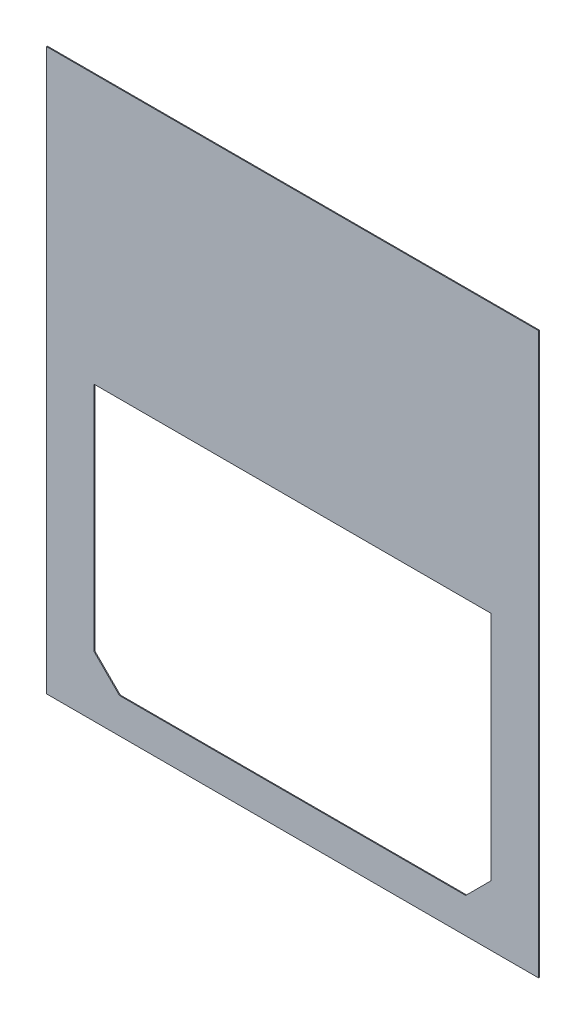
ISO-10303-21;
HEADER;
FILE_DESCRIPTION(('STEP AP214'),'2;1');
FILE_NAME('part.step','',(''),(''),'','','');
FILE_SCHEMA(('AUTOMOTIVE_DESIGN { 1 0 10303 214 1 1 1 1 }'));
ENDSEC;
DATA;
#1=APPLICATION_CONTEXT('core data for automotive mechanical design processes');
#2=APPLICATION_PROTOCOL_DEFINITION('international standard','automotive_design',2000,#1);
#3=PRODUCT_CONTEXT('',#1,'mechanical');
#4=PRODUCT('Part','Part','',(#3));
#5=PRODUCT_RELATED_PRODUCT_CATEGORY('part','',(#4));
#6=PRODUCT_DEFINITION_FORMATION('','',#4);
#7=PRODUCT_DEFINITION_CONTEXT('part definition',#1,'design');
#8=PRODUCT_DEFINITION('design','',#6,#7);
#9=PRODUCT_DEFINITION_SHAPE('','',#8);
#10=(LENGTH_UNIT() NAMED_UNIT(*) SI_UNIT(.MILLI.,.METRE.));
#11=(NAMED_UNIT(*) PLANE_ANGLE_UNIT() SI_UNIT($,.RADIAN.));
#12=(NAMED_UNIT(*) SI_UNIT($,.STERADIAN.) SOLID_ANGLE_UNIT());
#13=UNCERTAINTY_MEASURE_WITH_UNIT(LENGTH_MEASURE(1.E-05),#10,'distance_accuracy_value','');
#14=(GEOMETRIC_REPRESENTATION_CONTEXT(3) GLOBAL_UNCERTAINTY_ASSIGNED_CONTEXT((#13)) GLOBAL_UNIT_ASSIGNED_CONTEXT((#10,
#11,#12)) REPRESENTATION_CONTEXT('',''));
#15=CARTESIAN_POINT('',(0.,0.,0.));
#16=DIRECTION('',(0.,0.,1.));
#17=DIRECTION('',(1.,0.,0.));
#18=AXIS2_PLACEMENT_3D('',#15,#16,#17);
#19=CARTESIAN_POINT('',(-421.5,0.,-1.5));
#20=DIRECTION('',(-1.,0.,0.));
#21=DIRECTION('',(0.,0.,1.));
#22=AXIS2_PLACEMENT_3D('',#19,#20,#21);
#23=PLANE('',#22);
#24=DIRECTION('',(0.,-1.,0.));
#25=VECTOR('',#24,1.);
#26=CARTESIAN_POINT('',(-421.5,0.,0.));
#27=LINE('',#26,#25);
#28=CARTESIAN_POINT('',(-421.5,960.,0.));
#29=VERTEX_POINT('',#28);
#30=CARTESIAN_POINT('',(-421.5,0.,0.));
#31=VERTEX_POINT('',#30);
#32=EDGE_CURVE('E162',#29,#31,#27,.T.);
#33=ORIENTED_EDGE('',*,*,#32,.F.);
#34=DIRECTION('',(0.,0.,1.));
#35=VECTOR('',#34,1.);
#36=CARTESIAN_POINT('',(-421.5,960.,-1.5));
#37=LINE('',#36,#35);
#38=CARTESIAN_POINT('',(-421.5,960.,-1.5));
#39=VERTEX_POINT('',#38);
#40=EDGE_CURVE('E11',#39,#29,#37,.T.);
#41=ORIENTED_EDGE('',*,*,#40,.F.);
#42=DIRECTION('',(0.,-1.,0.));
#43=VECTOR('',#42,1.);
#44=CARTESIAN_POINT('',(-421.5,0.,-1.5));
#45=LINE('',#44,#43);
#46=CARTESIAN_POINT('',(-421.5,0.,-1.5));
#47=VERTEX_POINT('',#46);
#48=EDGE_CURVE('E170',#39,#47,#45,.T.);
#49=ORIENTED_EDGE('',*,*,#48,.T.);
#50=DIRECTION('',(0.,0.,1.));
#51=VECTOR('',#50,1.);
#52=CARTESIAN_POINT('',(-421.5,0.,-1.5));
#53=LINE('',#52,#51);
#54=EDGE_CURVE('E43',#47,#31,#53,.T.);
#55=ORIENTED_EDGE('',*,*,#54,.T.);
#56=EDGE_LOOP('',(#33,#41,#49,#55));
#57=FACE_BOUND('',#56,.T.);
#58=ADVANCED_FACE('F40',(#57),#23,.T.);
#59=CARTESIAN_POINT('',(-421.5,960.,-1.5));
#60=DIRECTION('',(0.,1.,0.));
#61=DIRECTION('',(-1.,0.,0.));
#62=AXIS2_PLACEMENT_3D('',#59,#60,#61);
#63=PLANE('',#62);
#64=DIRECTION('',(-1.,0.,0.));
#65=VECTOR('',#64,1.);
#66=CARTESIAN_POINT('',(-421.5,960.,0.));
#67=LINE('',#66,#65);
#68=CARTESIAN_POINT('',(421.5,960.,0.));
#69=VERTEX_POINT('',#68);
#70=EDGE_CURVE('E174',#69,#29,#67,.T.);
#71=ORIENTED_EDGE('',*,*,#70,.F.);
#72=DIRECTION('',(0.,0.,1.));
#73=VECTOR('',#72,1.);
#74=CARTESIAN_POINT('',(421.5,960.,-1.5));
#75=LINE('',#74,#73);
#76=CARTESIAN_POINT('',(421.5,960.,-1.5));
#77=VERTEX_POINT('',#76);
#78=EDGE_CURVE('E48',#77,#69,#75,.T.);
#79=ORIENTED_EDGE('',*,*,#78,.F.);
#80=DIRECTION('',(-1.,0.,0.));
#81=VECTOR('',#80,1.);
#82=CARTESIAN_POINT('',(-421.5,960.,-1.5));
#83=LINE('',#82,#81);
#84=EDGE_CURVE('E180',#77,#39,#83,.T.);
#85=ORIENTED_EDGE('',*,*,#84,.T.);
#86=ORIENTED_EDGE('',*,*,#40,.T.);
#87=EDGE_LOOP('',(#71,#79,#85,#86));
#88=FACE_BOUND('',#87,.T.);
#89=ADVANCED_FACE('F206',(#88),#63,.T.);
#90=CARTESIAN_POINT('',(421.5,1.03237725168122E-13,-1.5));
#91=DIRECTION('',(1.,0.,0.));
#92=DIRECTION('',(0.,1.,0.));
#93=AXIS2_PLACEMENT_3D('',#90,#91,#92);
#94=PLANE('',#93);
#95=DIRECTION('',(0.,1.,0.));
#96=VECTOR('',#95,1.);
#97=CARTESIAN_POINT('',(421.5,1.03237725168122E-13,0.));
#98=LINE('',#97,#96);
#99=CARTESIAN_POINT('',(421.5,1.03237725168122E-13,0.));
#100=VERTEX_POINT('',#99);
#101=EDGE_CURVE('E188',#100,#69,#98,.T.);
#102=ORIENTED_EDGE('',*,*,#101,.F.);
#103=DIRECTION('',(0.,0.,1.));
#104=VECTOR('',#103,1.);
#105=CARTESIAN_POINT('',(421.5,1.03237725168122E-13,-1.5));
#106=LINE('',#105,#104);
#107=CARTESIAN_POINT('',(421.5,1.03237725168122E-13,-1.5));
#108=VERTEX_POINT('',#107);
#109=EDGE_CURVE('E193',#108,#100,#106,.T.);
#110=ORIENTED_EDGE('',*,*,#109,.F.);
#111=DIRECTION('',(0.,1.,0.));
#112=VECTOR('',#111,1.);
#113=CARTESIAN_POINT('',(421.5,1.03237725168122E-13,-1.5));
#114=LINE('',#113,#112);
#115=EDGE_CURVE('E177',#108,#77,#114,.T.);
#116=ORIENTED_EDGE('',*,*,#115,.T.);
#117=ORIENTED_EDGE('',*,*,#78,.T.);
#118=EDGE_LOOP('',(#102,#110,#116,#117));
#119=FACE_BOUND('',#118,.T.);
#120=ADVANCED_FACE('F210',(#119),#94,.T.);
#121=CARTESIAN_POINT('',(-421.5,0.,-1.5));
#122=DIRECTION('',(0.,-1.,0.));
#123=DIRECTION('',(1.,0.,0.));
#124=AXIS2_PLACEMENT_3D('',#121,#122,#123);
#125=PLANE('',#124);
#126=DIRECTION('',(1.,0.,0.));
#127=VECTOR('',#126,1.);
#128=CARTESIAN_POINT('',(-421.5,0.,0.));
#129=LINE('',#128,#127);
#130=EDGE_CURVE('E185',#31,#100,#129,.T.);
#131=ORIENTED_EDGE('',*,*,#130,.F.);
#132=ORIENTED_EDGE('',*,*,#54,.F.);
#133=DIRECTION('',(1.,0.,0.));
#134=VECTOR('',#133,1.);
#135=CARTESIAN_POINT('',(-421.5,0.,-1.5));
#136=LINE('',#135,#134);
#137=EDGE_CURVE('E173',#47,#108,#136,.T.);
#138=ORIENTED_EDGE('',*,*,#137,.T.);
#139=ORIENTED_EDGE('',*,*,#109,.T.);
#140=EDGE_LOOP('',(#131,#132,#138,#139));
#141=FACE_BOUND('',#140,.T.);
#142=ADVANCED_FACE('F201',(#141),#125,.T.);
#143=CARTESIAN_POINT('',(0.,0.,-1.5));
#144=DIRECTION('',(0.,0.,-1.));
#145=DIRECTION('',(-1.,0.,0.));
#146=AXIS2_PLACEMENT_3D('',#143,#144,#145);
#147=PLANE('',#146);
#148=DIRECTION('',(-1.,0.,0.));
#149=VECTOR('',#148,1.);
#150=CARTESIAN_POINT('',(-340.,500.,-1.5));
#151=LINE('',#150,#149);
#152=CARTESIAN_POINT('',(340.,500.,-1.5));
#153=VERTEX_POINT('',#152);
#154=CARTESIAN_POINT('',(-340.,500.,-1.5));
#155=VERTEX_POINT('',#154);
#156=EDGE_CURVE('E119',#153,#155,#151,.T.);
#157=ORIENTED_EDGE('',*,*,#156,.T.);
#158=DIRECTION('',(0.,-1.,0.));
#159=VECTOR('',#158,1.);
#160=CARTESIAN_POINT('',(-340.,500.,-1.5));
#161=LINE('',#160,#159);
#162=CARTESIAN_POINT('',(-340.,103.5,-1.5));
#163=VERTEX_POINT('',#162);
#164=EDGE_CURVE('E128',#155,#163,#161,.T.);
#165=ORIENTED_EDGE('',*,*,#164,.T.);
#166=DIRECTION('',(0.707106781186546,-0.70710678118655,0.));
#167=VECTOR('',#166,1.);
#168=CARTESIAN_POINT('',(-340.,103.5,-1.5));
#169=LINE('',#168,#167);
#170=CARTESIAN_POINT('',(-296.5,60.,-1.5));
#171=VERTEX_POINT('',#170);
#172=EDGE_CURVE('E56',#163,#171,#169,.T.);
#173=ORIENTED_EDGE('',*,*,#172,.T.);
#174=DIRECTION('',(1.,0.,0.));
#175=VECTOR('',#174,1.);
#176=CARTESIAN_POINT('',(-296.5,60.,-1.5));
#177=LINE('',#176,#175);
#178=CARTESIAN_POINT('',(296.5,60.0000000000001,-1.5));
#179=VERTEX_POINT('',#178);
#180=EDGE_CURVE('E143',#171,#179,#177,.T.);
#181=ORIENTED_EDGE('',*,*,#180,.T.);
#182=DIRECTION('',(0.707106781186545,0.70710678118655,0.));
#183=VECTOR('',#182,1.);
#184=CARTESIAN_POINT('',(340.,103.5,-1.5));
#185=LINE('',#184,#183);
#186=CARTESIAN_POINT('',(340.,103.5,-1.5));
#187=VERTEX_POINT('',#186);
#188=EDGE_CURVE('E146',#179,#187,#185,.T.);
#189=ORIENTED_EDGE('',*,*,#188,.T.);
#190=DIRECTION('',(0.,1.,0.));
#191=VECTOR('',#190,1.);
#192=CARTESIAN_POINT('',(340.,500.,-1.5));
#193=LINE('',#192,#191);
#194=EDGE_CURVE('E125',#187,#153,#193,.T.);
#195=ORIENTED_EDGE('',*,*,#194,.T.);
#196=EDGE_LOOP('',(#157,#165,#173,#181,#189,#195));
#197=FACE_BOUND('',#196,.T.);
#198=ORIENTED_EDGE('',*,*,#48,.F.);
#199=ORIENTED_EDGE('',*,*,#84,.F.);
#200=ORIENTED_EDGE('',*,*,#115,.F.);
#201=ORIENTED_EDGE('',*,*,#137,.F.);
#202=EDGE_LOOP('',(#198,#199,#200,#201));
#203=FACE_BOUND('',#202,.T.);
#204=ADVANCED_FACE('F132',(#197,#203),#147,.T.);
#205=CARTESIAN_POINT('',(0.,0.,0.));
#206=DIRECTION('',(0.,0.,-1.));
#207=DIRECTION('',(-1.,0.,0.));
#208=AXIS2_PLACEMENT_3D('',#205,#206,#207);
#209=PLANE('',#208);
#210=DIRECTION('',(0.,-1.,0.));
#211=VECTOR('',#210,1.);
#212=CARTESIAN_POINT('',(-340.,500.,0.));
#213=LINE('',#212,#211);
#214=CARTESIAN_POINT('',(-340.,500.,0.));
#215=VERTEX_POINT('',#214);
#216=CARTESIAN_POINT('',(-340.,103.5,0.));
#217=VERTEX_POINT('',#216);
#218=EDGE_CURVE('E150',#215,#217,#213,.T.);
#219=ORIENTED_EDGE('',*,*,#218,.F.);
#220=DIRECTION('',(-1.,0.,0.));
#221=VECTOR('',#220,1.);
#222=CARTESIAN_POINT('',(-340.,500.,0.));
#223=LINE('',#222,#221);
#224=CARTESIAN_POINT('',(340.,500.,0.));
#225=VERTEX_POINT('',#224);
#226=EDGE_CURVE('E64',#225,#215,#223,.T.);
#227=ORIENTED_EDGE('',*,*,#226,.F.);
#228=DIRECTION('',(0.,1.,0.));
#229=VECTOR('',#228,1.);
#230=CARTESIAN_POINT('',(340.,500.,0.));
#231=LINE('',#230,#229);
#232=CARTESIAN_POINT('',(340.,103.5,0.));
#233=VERTEX_POINT('',#232);
#234=EDGE_CURVE('E136',#233,#225,#231,.T.);
#235=ORIENTED_EDGE('',*,*,#234,.F.);
#236=DIRECTION('',(0.707106781186545,0.70710678118655,0.));
#237=VECTOR('',#236,1.);
#238=CARTESIAN_POINT('',(340.,103.5,0.));
#239=LINE('',#238,#237);
#240=CARTESIAN_POINT('',(296.5,60.0000000000001,0.));
#241=VERTEX_POINT('',#240);
#242=EDGE_CURVE('E139',#241,#233,#239,.T.);
#243=ORIENTED_EDGE('',*,*,#242,.F.);
#244=DIRECTION('',(1.,0.,0.));
#245=VECTOR('',#244,1.);
#246=CARTESIAN_POINT('',(-296.5,60.,0.));
#247=LINE('',#246,#245);
#248=CARTESIAN_POINT('',(-296.5,60.,0.));
#249=VERTEX_POINT('',#248);
#250=EDGE_CURVE('E155',#249,#241,#247,.T.);
#251=ORIENTED_EDGE('',*,*,#250,.F.);
#252=DIRECTION('',(0.707106781186546,-0.70710678118655,0.));
#253=VECTOR('',#252,1.);
#254=CARTESIAN_POINT('',(-340.,103.5,0.));
#255=LINE('',#254,#253);
#256=EDGE_CURVE('E152',#217,#249,#255,.T.);
#257=ORIENTED_EDGE('',*,*,#256,.F.);
#258=EDGE_LOOP('',(#219,#227,#235,#243,#251,#257));
#259=FACE_BOUND('',#258,.T.);
#260=ORIENTED_EDGE('',*,*,#32,.T.);
#261=ORIENTED_EDGE('',*,*,#130,.T.);
#262=ORIENTED_EDGE('',*,*,#101,.T.);
#263=ORIENTED_EDGE('',*,*,#70,.T.);
#264=EDGE_LOOP('',(#260,#261,#262,#263));
#265=FACE_BOUND('',#264,.T.);
#266=ADVANCED_FACE('F203',(#259,#265),#209,.F.);
#267=CARTESIAN_POINT('',(-340.,500.,-1.5));
#268=DIRECTION('',(0.,1.,0.));
#269=DIRECTION('',(-1.,0.,0.));
#270=AXIS2_PLACEMENT_3D('',#267,#268,#269);
#271=PLANE('',#270);
#272=ORIENTED_EDGE('',*,*,#226,.T.);
#273=DIRECTION('',(0.,0.,1.));
#274=VECTOR('',#273,1.);
#275=CARTESIAN_POINT('',(-340.,500.,-1.5));
#276=LINE('',#275,#274);
#277=EDGE_CURVE('E115',#155,#215,#276,.T.);
#278=ORIENTED_EDGE('',*,*,#277,.F.);
#279=ORIENTED_EDGE('',*,*,#156,.F.);
#280=DIRECTION('',(0.,0.,1.));
#281=VECTOR('',#280,1.);
#282=CARTESIAN_POINT('',(340.,500.,-1.5));
#283=LINE('',#282,#281);
#284=EDGE_CURVE('E160',#153,#225,#283,.T.);
#285=ORIENTED_EDGE('',*,*,#284,.T.);
#286=EDGE_LOOP('',(#272,#278,#279,#285));
#287=FACE_BOUND('',#286,.T.);
#288=ADVANCED_FACE('F117',(#287),#271,.F.);
#289=CARTESIAN_POINT('',(340.,500.,-1.5));
#290=DIRECTION('',(1.,0.,0.));
#291=DIRECTION('',(0.,1.,0.));
#292=AXIS2_PLACEMENT_3D('',#289,#290,#291);
#293=PLANE('',#292);
#294=ORIENTED_EDGE('',*,*,#234,.T.);
#295=ORIENTED_EDGE('',*,*,#284,.F.);
#296=ORIENTED_EDGE('',*,*,#194,.F.);
#297=DIRECTION('',(0.,0.,1.));
#298=VECTOR('',#297,1.);
#299=CARTESIAN_POINT('',(340.,103.5,-1.5));
#300=LINE('',#299,#298);
#301=EDGE_CURVE('E163',#187,#233,#300,.T.);
#302=ORIENTED_EDGE('',*,*,#301,.T.);
#303=EDGE_LOOP('',(#294,#295,#296,#302));
#304=FACE_BOUND('',#303,.T.);
#305=ADVANCED_FACE('F266',(#304),#293,.F.);
#306=CARTESIAN_POINT('',(340.,103.5,-1.5));
#307=DIRECTION('',(0.707106781186549,-0.707106781186545,0.));
#308=DIRECTION('',(0.707106781186545,0.70710678118655,0.));
#309=AXIS2_PLACEMENT_3D('',#306,#307,#308);
#310=PLANE('',#309);
#311=ORIENTED_EDGE('',*,*,#242,.T.);
#312=ORIENTED_EDGE('',*,*,#301,.F.);
#313=ORIENTED_EDGE('',*,*,#188,.F.);
#314=DIRECTION('',(0.,0.,1.));
#315=VECTOR('',#314,1.);
#316=CARTESIAN_POINT('',(296.5,60.0000000000001,-1.5));
#317=LINE('',#316,#315);
#318=EDGE_CURVE('E165',#179,#241,#317,.T.);
#319=ORIENTED_EDGE('',*,*,#318,.T.);
#320=EDGE_LOOP('',(#311,#312,#313,#319));
#321=FACE_BOUND('',#320,.T.);
#322=ADVANCED_FACE('F276',(#321),#310,.F.);
#323=CARTESIAN_POINT('',(-296.5,60.,-1.5));
#324=DIRECTION('',(0.,-1.,0.));
#325=DIRECTION('',(1.,0.,0.));
#326=AXIS2_PLACEMENT_3D('',#323,#324,#325);
#327=PLANE('',#326);
#328=ORIENTED_EDGE('',*,*,#250,.T.);
#329=ORIENTED_EDGE('',*,*,#318,.F.);
#330=ORIENTED_EDGE('',*,*,#180,.F.);
#331=DIRECTION('',(0.,0.,1.));
#332=VECTOR('',#331,1.);
#333=CARTESIAN_POINT('',(-296.5,60.,-1.5));
#334=LINE('',#333,#332);
#335=EDGE_CURVE('E167',#171,#249,#334,.T.);
#336=ORIENTED_EDGE('',*,*,#335,.T.);
#337=EDGE_LOOP('',(#328,#329,#330,#336));
#338=FACE_BOUND('',#337,.T.);
#339=ADVANCED_FACE('F287',(#338),#327,.F.);
#340=CARTESIAN_POINT('',(-340.,103.5,-1.5));
#341=DIRECTION('',(-0.707106781186549,-0.707106781186545,0.));
#342=DIRECTION('',(0.707106781186546,-0.70710678118655,0.));
#343=AXIS2_PLACEMENT_3D('',#340,#341,#342);
#344=PLANE('',#343);
#345=ORIENTED_EDGE('',*,*,#256,.T.);
#346=ORIENTED_EDGE('',*,*,#335,.F.);
#347=ORIENTED_EDGE('',*,*,#172,.F.);
#348=DIRECTION('',(0.,0.,1.));
#349=VECTOR('',#348,1.);
#350=CARTESIAN_POINT('',(-340.,103.5,-1.5));
#351=LINE('',#350,#349);
#352=EDGE_CURVE('E124',#163,#217,#351,.T.);
#353=ORIENTED_EDGE('',*,*,#352,.T.);
#354=EDGE_LOOP('',(#345,#346,#347,#353));
#355=FACE_BOUND('',#354,.T.);
#356=ADVANCED_FACE('F298',(#355),#344,.F.);
#357=CARTESIAN_POINT('',(-340.,500.,-1.5));
#358=DIRECTION('',(-1.,0.,0.));
#359=DIRECTION('',(0.,-1.,0.));
#360=AXIS2_PLACEMENT_3D('',#357,#358,#359);
#361=PLANE('',#360);
#362=ORIENTED_EDGE('',*,*,#218,.T.);
#363=ORIENTED_EDGE('',*,*,#352,.F.);
#364=ORIENTED_EDGE('',*,*,#164,.F.);
#365=ORIENTED_EDGE('',*,*,#277,.T.);
#366=EDGE_LOOP('',(#362,#363,#364,#365));
#367=FACE_BOUND('',#366,.T.);
#368=ADVANCED_FACE('F129',(#367),#361,.F.);
#369=CLOSED_SHELL('',(#58,#89,#120,#142,#204,#266,#288,#305,#322,#339,#356,#368));
#370=MANIFOLD_SOLID_BREP('B2',#369);
#371=ADVANCED_BREP_SHAPE_REPRESENTATION('',(#18,#370),#14);
#372=SHAPE_DEFINITION_REPRESENTATION(#9,#371);
ENDSEC;
END-ISO-10303-21;
